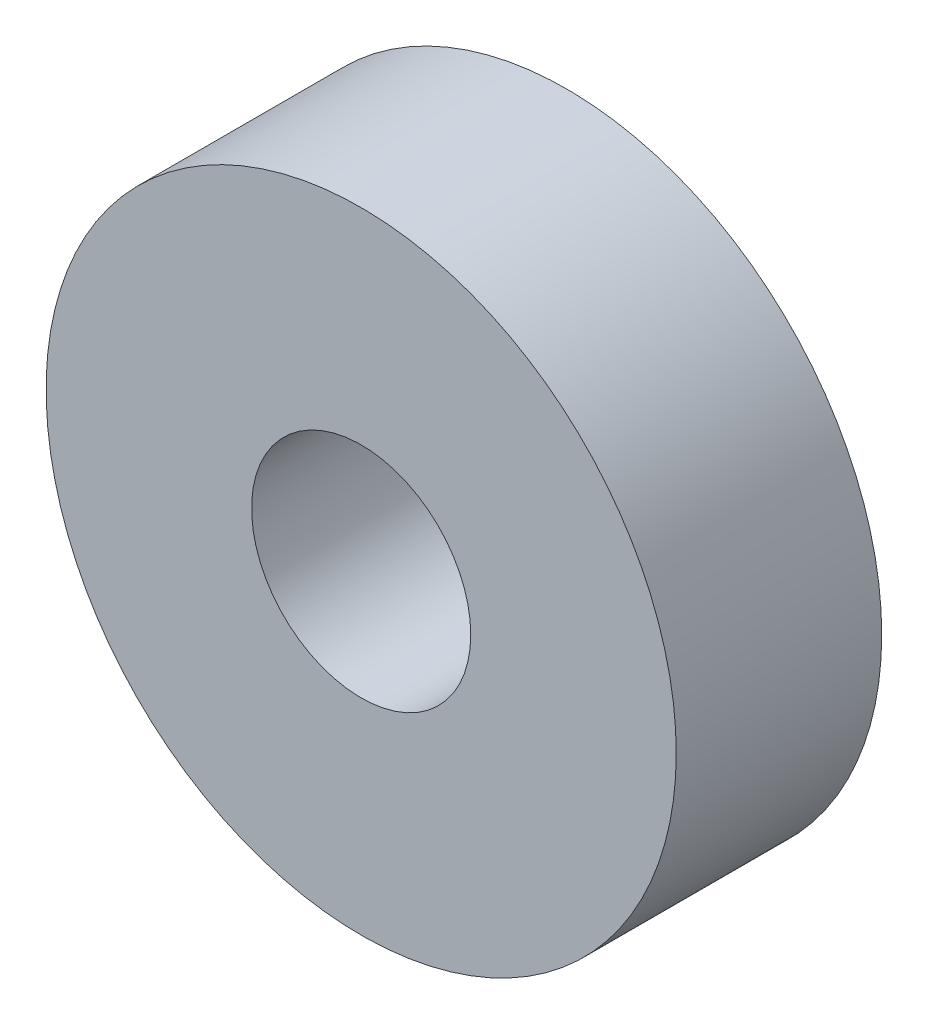
ISO-10303-21;
HEADER;
FILE_DESCRIPTION(('STEP AP214'),'2;1');
FILE_NAME('part.step','',(''),(''),'','','');
FILE_SCHEMA(('AUTOMOTIVE_DESIGN { 1 0 10303 214 1 1 1 1 }'));
ENDSEC;
DATA;
#1=APPLICATION_CONTEXT('core data for automotive mechanical design processes');
#2=APPLICATION_PROTOCOL_DEFINITION('international standard','automotive_design',2000,#1);
#3=PRODUCT_CONTEXT('',#1,'mechanical');
#4=PRODUCT('Part','Part','',(#3));
#5=PRODUCT_RELATED_PRODUCT_CATEGORY('part','',(#4));
#6=PRODUCT_DEFINITION_FORMATION('','',#4);
#7=PRODUCT_DEFINITION_CONTEXT('part definition',#1,'design');
#8=PRODUCT_DEFINITION('design','',#6,#7);
#9=PRODUCT_DEFINITION_SHAPE('','',#8);
#10=(LENGTH_UNIT() NAMED_UNIT(*) SI_UNIT(.MILLI.,.METRE.));
#11=(NAMED_UNIT(*) PLANE_ANGLE_UNIT() SI_UNIT($,.RADIAN.));
#12=(NAMED_UNIT(*) SI_UNIT($,.STERADIAN.) SOLID_ANGLE_UNIT());
#13=UNCERTAINTY_MEASURE_WITH_UNIT(LENGTH_MEASURE(1.E-05),#10,'distance_accuracy_value','');
#14=(GEOMETRIC_REPRESENTATION_CONTEXT(3) GLOBAL_UNCERTAINTY_ASSIGNED_CONTEXT((#13)) GLOBAL_UNIT_ASSIGNED_CONTEXT((#10,
#11,#12)) REPRESENTATION_CONTEXT('',''));
#15=CARTESIAN_POINT('',(0.,0.,0.));
#16=DIRECTION('',(0.,0.,1.));
#17=DIRECTION('',(1.,0.,0.));
#18=AXIS2_PLACEMENT_3D('',#15,#16,#17);
#19=CARTESIAN_POINT('',(0.,0.,3.));
#20=DIRECTION('',(0.,0.,1.));
#21=DIRECTION('',(1.,0.,0.));
#22=AXIS2_PLACEMENT_3D('',#19,#20,#21);
#23=PLANE('',#22);
#24=CARTESIAN_POINT('',(0.,0.,3.));
#25=DIRECTION('',(0.,0.,1.));
#26=DIRECTION('',(1.,0.,0.));
#27=AXIS2_PLACEMENT_3D('',#24,#25,#26);
#28=CIRCLE('',#27,4.6);
#29=CARTESIAN_POINT('',(4.6,0.,3.));
#30=VERTEX_POINT('',#29);
#31=EDGE_CURVE('E10',#30,#30,#28,.T.);
#32=ORIENTED_EDGE('',*,*,#31,.T.);
#33=EDGE_LOOP('',(#32));
#34=FACE_BOUND('',#33,.T.);
#35=CARTESIAN_POINT('',(0.,0.,3.));
#36=DIRECTION('',(0.,0.,1.));
#37=DIRECTION('',(1.,0.,0.));
#38=AXIS2_PLACEMENT_3D('',#35,#36,#37);
#39=CIRCLE('',#38,1.6);
#40=CARTESIAN_POINT('',(1.6,0.,3.));
#41=VERTEX_POINT('',#40);
#42=EDGE_CURVE('E42',#41,#41,#39,.T.);
#43=ORIENTED_EDGE('',*,*,#42,.F.);
#44=EDGE_LOOP('',(#43));
#45=FACE_BOUND('',#44,.T.);
#46=ADVANCED_FACE('F31',(#34,#45),#23,.T.);
#47=CARTESIAN_POINT('',(0.,0.,0.));
#48=DIRECTION('',(0.,0.,1.));
#49=DIRECTION('',(1.,0.,0.));
#50=AXIS2_PLACEMENT_3D('',#47,#48,#49);
#51=PLANE('',#50);
#52=CARTESIAN_POINT('',(0.,0.,0.));
#53=DIRECTION('',(0.,0.,1.));
#54=DIRECTION('',(1.,0.,0.));
#55=AXIS2_PLACEMENT_3D('',#52,#53,#54);
#56=CIRCLE('',#55,4.6);
#57=CARTESIAN_POINT('',(4.6,0.,0.));
#58=VERTEX_POINT('',#57);
#59=EDGE_CURVE('E35',#58,#58,#56,.T.);
#60=ORIENTED_EDGE('',*,*,#59,.F.);
#61=EDGE_LOOP('',(#60));
#62=FACE_BOUND('',#61,.T.);
#63=CARTESIAN_POINT('',(0.,0.,0.));
#64=DIRECTION('',(0.,0.,1.));
#65=DIRECTION('',(1.,0.,0.));
#66=AXIS2_PLACEMENT_3D('',#63,#64,#65);
#67=CIRCLE('',#66,1.6);
#68=CARTESIAN_POINT('',(1.6,0.,0.));
#69=VERTEX_POINT('',#68);
#70=EDGE_CURVE('E44',#69,#69,#67,.T.);
#71=ORIENTED_EDGE('',*,*,#70,.T.);
#72=EDGE_LOOP('',(#71));
#73=FACE_BOUND('',#72,.T.);
#74=ADVANCED_FACE('F54',(#62,#73),#51,.F.);
#75=CARTESIAN_POINT('',(0.,0.,3.));
#76=DIRECTION('',(0.,0.,-1.));
#77=DIRECTION('',(-1.,0.,0.));
#78=AXIS2_PLACEMENT_3D('',#75,#76,#77);
#79=CYLINDRICAL_SURFACE('',#78,4.6);
#80=ORIENTED_EDGE('',*,*,#31,.F.);
#81=EDGE_LOOP('',(#80));
#82=FACE_BOUND('',#81,.T.);
#83=ORIENTED_EDGE('',*,*,#59,.T.);
#84=EDGE_LOOP('',(#83));
#85=FACE_BOUND('',#84,.T.);
#86=ADVANCED_FACE('F33',(#82,#85),#79,.T.);
#87=CARTESIAN_POINT('',(0.,0.,3.));
#88=DIRECTION('',(0.,0.,-1.));
#89=DIRECTION('',(-1.,0.,0.));
#90=AXIS2_PLACEMENT_3D('',#87,#88,#89);
#91=CYLINDRICAL_SURFACE('',#90,1.6);
#92=ORIENTED_EDGE('',*,*,#42,.T.);
#93=EDGE_LOOP('',(#92));
#94=FACE_BOUND('',#93,.T.);
#95=ORIENTED_EDGE('',*,*,#70,.F.);
#96=EDGE_LOOP('',(#95));
#97=FACE_BOUND('',#96,.T.);
#98=ADVANCED_FACE('F50',(#94,#97),#91,.F.);
#99=CLOSED_SHELL('',(#46,#74,#86,#98));
#100=MANIFOLD_SOLID_BREP('B2',#99);
#101=ADVANCED_BREP_SHAPE_REPRESENTATION('',(#18,#100),#14);
#102=SHAPE_DEFINITION_REPRESENTATION(#9,#101);
ENDSEC;
END-ISO-10303-21;
